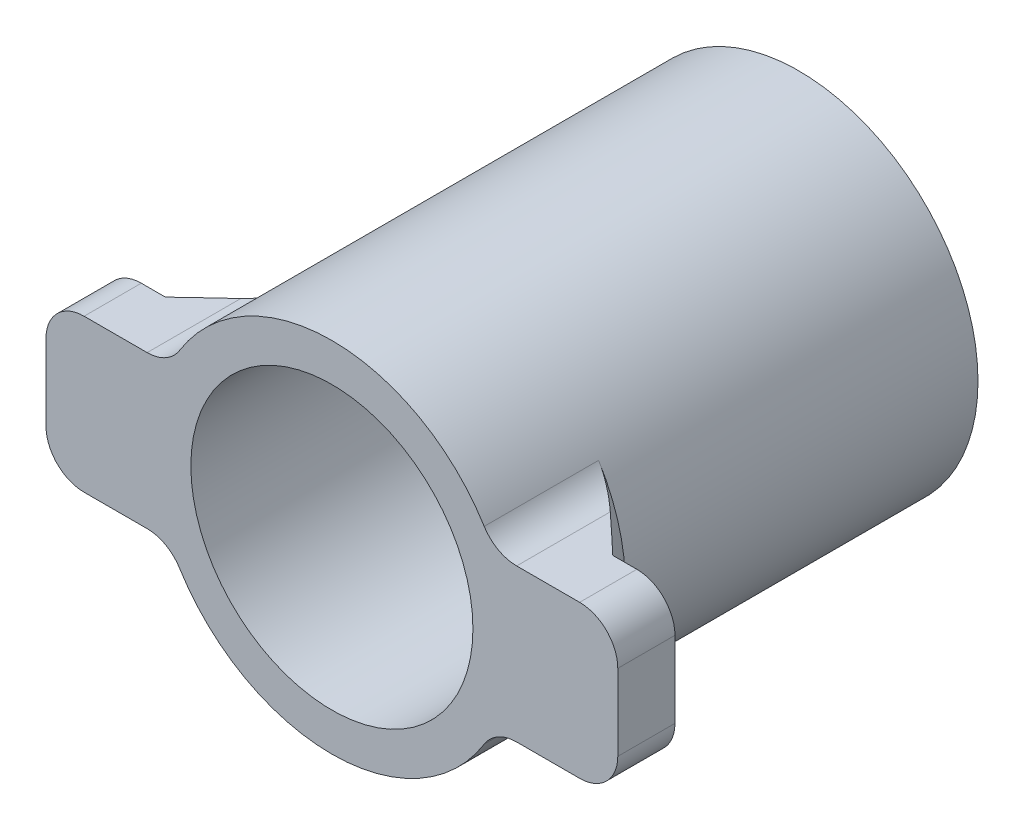
ISO-10303-21;
HEADER;
FILE_DESCRIPTION(('STEP AP214'),'2;1');
FILE_NAME('part.step','',(''),(''),'','','');
FILE_SCHEMA(('AUTOMOTIVE_DESIGN { 1 0 10303 214 1 1 1 1 }'));
ENDSEC;
DATA;
#1=APPLICATION_CONTEXT('core data for automotive mechanical design processes');
#2=APPLICATION_PROTOCOL_DEFINITION('international standard','automotive_design',2000,#1);
#3=PRODUCT_CONTEXT('',#1,'mechanical');
#4=PRODUCT('Part','Part','',(#3));
#5=PRODUCT_RELATED_PRODUCT_CATEGORY('part','',(#4));
#6=PRODUCT_DEFINITION_FORMATION('','',#4);
#7=PRODUCT_DEFINITION_CONTEXT('part definition',#1,'design');
#8=PRODUCT_DEFINITION('design','',#6,#7);
#9=PRODUCT_DEFINITION_SHAPE('','',#8);
#10=(LENGTH_UNIT() NAMED_UNIT(*) SI_UNIT(.MILLI.,.METRE.));
#11=(NAMED_UNIT(*) PLANE_ANGLE_UNIT() SI_UNIT($,.RADIAN.));
#12=(NAMED_UNIT(*) SI_UNIT($,.STERADIAN.) SOLID_ANGLE_UNIT());
#13=UNCERTAINTY_MEASURE_WITH_UNIT(LENGTH_MEASURE(1.E-05),#10,'distance_accuracy_value','');
#14=(GEOMETRIC_REPRESENTATION_CONTEXT(3) GLOBAL_UNCERTAINTY_ASSIGNED_CONTEXT((#13)) GLOBAL_UNIT_ASSIGNED_CONTEXT((#10,
#11,#12)) REPRESENTATION_CONTEXT('',''));
#15=CARTESIAN_POINT('',(0.,0.,0.));
#16=DIRECTION('',(0.,0.,1.));
#17=DIRECTION('',(1.,0.,0.));
#18=AXIS2_PLACEMENT_3D('',#15,#16,#17);
#19=CARTESIAN_POINT('',(0.,0.,24.5));
#20=DIRECTION('',(0.,0.,1.));
#21=DIRECTION('',(1.,0.,0.));
#22=AXIS2_PLACEMENT_3D('',#19,#20,#21);
#23=PLANE('',#22);
#24=DIRECTION('',(0.,1.,0.));
#25=VECTOR('',#24,1.);
#26=CARTESIAN_POINT('',(15.,-4.,24.5));
#27=LINE('',#26,#25);
#28=CARTESIAN_POINT('',(15.,-2.,24.5));
#29=VERTEX_POINT('',#28);
#30=CARTESIAN_POINT('',(15.,2.,24.5));
#31=VERTEX_POINT('',#30);
#32=EDGE_CURVE('E171',#29,#31,#27,.T.);
#33=ORIENTED_EDGE('',*,*,#32,.T.);
#34=CARTESIAN_POINT('',(13.,2.,24.5));
#35=DIRECTION('',(0.,0.,1.));
#36=DIRECTION('',(1.,0.,0.));
#37=AXIS2_PLACEMENT_3D('',#34,#35,#36);
#38=CIRCLE('',#37,2.);
#39=CARTESIAN_POINT('',(13.,4.,24.5));
#40=VERTEX_POINT('',#39);
#41=EDGE_CURVE('E206',#31,#40,#38,.T.);
#42=ORIENTED_EDGE('',*,*,#41,.T.);
#43=DIRECTION('',(-1.,0.,0.));
#44=VECTOR('',#43,1.);
#45=CARTESIAN_POINT('',(6.22575296650935,4.,24.5));
#46=LINE('',#45,#44);
#47=CARTESIAN_POINT('',(9.69329665284211,4.,24.5));
#48=VERTEX_POINT('',#47);
#49=EDGE_CURVE('E187',#40,#48,#46,.T.);
#50=ORIENTED_EDGE('',*,*,#49,.T.);
#51=CARTESIAN_POINT('',(9.69329665284211,6.,24.5));
#52=DIRECTION('',(0.,0.,1.));
#53=DIRECTION('',(1.,0.,0.));
#54=AXIS2_PLACEMENT_3D('',#51,#52,#53);
#55=CIRCLE('',#54,2.);
#56=CARTESIAN_POINT('',(7.99271829269437,4.94736842105263,24.5));
#57=VERTEX_POINT('',#56);
#58=EDGE_CURVE('E252',#48,#57,#55,.F.);
#59=ORIENTED_EDGE('',*,*,#58,.T.);
#60=CARTESIAN_POINT('',(0.,0.,24.5));
#61=DIRECTION('',(0.,0.,1.));
#62=DIRECTION('',(1.,0.,0.));
#63=AXIS2_PLACEMENT_3D('',#60,#61,#62);
#64=CIRCLE('',#63,9.4);
#65=CARTESIAN_POINT('',(-7.99271829269437,4.94736842105263,24.5));
#66=VERTEX_POINT('',#65);
#67=EDGE_CURVE('E194',#57,#66,#64,.T.);
#68=ORIENTED_EDGE('',*,*,#67,.T.);
#69=CARTESIAN_POINT('',(-9.69329665284211,6.,24.5));
#70=DIRECTION('',(0.,0.,1.));
#71=DIRECTION('',(1.,0.,0.));
#72=AXIS2_PLACEMENT_3D('',#69,#70,#71);
#73=CIRCLE('',#72,2.);
#74=CARTESIAN_POINT('',(-9.69329665284211,4.,24.5));
#75=VERTEX_POINT('',#74);
#76=EDGE_CURVE('E246',#66,#75,#73,.F.);
#77=ORIENTED_EDGE('',*,*,#76,.T.);
#78=DIRECTION('',(-1.,0.,0.));
#79=VECTOR('',#78,1.);
#80=CARTESIAN_POINT('',(-15.,4.,24.5));
#81=LINE('',#80,#79);
#82=CARTESIAN_POINT('',(-13.,4.,24.5));
#83=VERTEX_POINT('',#82);
#84=EDGE_CURVE('E394',#75,#83,#81,.T.);
#85=ORIENTED_EDGE('',*,*,#84,.T.);
#86=CARTESIAN_POINT('',(-13.,2.,24.5));
#87=DIRECTION('',(0.,0.,1.));
#88=DIRECTION('',(1.,0.,0.));
#89=AXIS2_PLACEMENT_3D('',#86,#87,#88);
#90=CIRCLE('',#89,2.);
#91=CARTESIAN_POINT('',(-15.,2.,24.5));
#92=VERTEX_POINT('',#91);
#93=EDGE_CURVE('E204',#83,#92,#90,.T.);
#94=ORIENTED_EDGE('',*,*,#93,.T.);
#95=DIRECTION('',(0.,-1.,0.));
#96=VECTOR('',#95,1.);
#97=CARTESIAN_POINT('',(-15.,-4.,24.5));
#98=LINE('',#97,#96);
#99=CARTESIAN_POINT('',(-15.,-2.,24.5));
#100=VERTEX_POINT('',#99);
#101=EDGE_CURVE('E401',#92,#100,#98,.T.);
#102=ORIENTED_EDGE('',*,*,#101,.T.);
#103=CARTESIAN_POINT('',(-13.,-2.,24.5));
#104=DIRECTION('',(0.,0.,1.));
#105=DIRECTION('',(1.,0.,0.));
#106=AXIS2_PLACEMENT_3D('',#103,#104,#105);
#107=CIRCLE('',#106,2.);
#108=CARTESIAN_POINT('',(-13.,-4.,24.5));
#109=VERTEX_POINT('',#108);
#110=EDGE_CURVE('E177',#100,#109,#107,.T.);
#111=ORIENTED_EDGE('',*,*,#110,.T.);
#112=DIRECTION('',(1.,0.,0.));
#113=VECTOR('',#112,1.);
#114=CARTESIAN_POINT('',(-15.,-4.,24.5));
#115=LINE('',#114,#113);
#116=CARTESIAN_POINT('',(-9.69329665284211,-4.,24.5));
#117=VERTEX_POINT('',#116);
#118=EDGE_CURVE('E398',#109,#117,#115,.T.);
#119=ORIENTED_EDGE('',*,*,#118,.T.);
#120=CARTESIAN_POINT('',(-9.69329665284211,-6.,24.5));
#121=DIRECTION('',(0.,0.,1.));
#122=DIRECTION('',(1.,0.,0.));
#123=AXIS2_PLACEMENT_3D('',#120,#121,#122);
#124=CIRCLE('',#123,2.);
#125=CARTESIAN_POINT('',(-7.99271829269437,-4.94736842105263,24.5));
#126=VERTEX_POINT('',#125);
#127=EDGE_CURVE('E248',#117,#126,#124,.F.);
#128=ORIENTED_EDGE('',*,*,#127,.T.);
#129=CARTESIAN_POINT('',(7.99271829269437,-4.94736842105263,24.5));
#130=VERTEX_POINT('',#129);
#131=EDGE_CURVE('E198',#126,#130,#64,.T.);
#132=ORIENTED_EDGE('',*,*,#131,.T.);
#133=CARTESIAN_POINT('',(9.69329665284211,-6.,24.5));
#134=DIRECTION('',(0.,0.,1.));
#135=DIRECTION('',(1.,0.,0.));
#136=AXIS2_PLACEMENT_3D('',#133,#134,#135);
#137=CIRCLE('',#136,2.);
#138=CARTESIAN_POINT('',(9.69329665284211,-4.,24.5));
#139=VERTEX_POINT('',#138);
#140=EDGE_CURVE('E250',#130,#139,#137,.F.);
#141=ORIENTED_EDGE('',*,*,#140,.T.);
#142=DIRECTION('',(1.,0.,0.));
#143=VECTOR('',#142,1.);
#144=CARTESIAN_POINT('',(6.22575296650935,-4.,24.5));
#145=LINE('',#144,#143);
#146=CARTESIAN_POINT('',(13.,-4.,24.5));
#147=VERTEX_POINT('',#146);
#148=EDGE_CURVE('E172',#139,#147,#145,.T.);
#149=ORIENTED_EDGE('',*,*,#148,.T.);
#150=CARTESIAN_POINT('',(13.,-2.,24.5));
#151=DIRECTION('',(0.,0.,1.));
#152=DIRECTION('',(1.,0.,0.));
#153=AXIS2_PLACEMENT_3D('',#150,#151,#152);
#154=CIRCLE('',#153,2.);
#155=EDGE_CURVE('E168',#147,#29,#154,.T.);
#156=ORIENTED_EDGE('',*,*,#155,.T.);
#157=EDGE_LOOP('',(#33,#42,#50,#59,#68,#77,#85,#94,#102,#111,#119,#128,#132,#141,#149,#156));
#158=FACE_BOUND('',#157,.T.);
#159=CARTESIAN_POINT('',(0.,0.,24.5));
#160=DIRECTION('',(0.,0.,1.));
#161=DIRECTION('',(1.,0.,0.));
#162=AXIS2_PLACEMENT_3D('',#159,#160,#161);
#163=CIRCLE('',#162,7.4);
#164=CARTESIAN_POINT('',(7.4,0.,24.5));
#165=VERTEX_POINT('',#164);
#166=EDGE_CURVE('E377',#165,#165,#163,.T.);
#167=ORIENTED_EDGE('',*,*,#166,.F.);
#168=EDGE_LOOP('',(#167));
#169=FACE_BOUND('',#168,.T.);
#170=ADVANCED_FACE('F35',(#158,#169),#23,.T.);
#171=CARTESIAN_POINT('',(0.,0.,0.));
#172=DIRECTION('',(0.,0.,1.));
#173=DIRECTION('',(1.,0.,0.));
#174=AXIS2_PLACEMENT_3D('',#171,#172,#173);
#175=PLANE('',#174);
#176=CARTESIAN_POINT('',(0.,0.,0.));
#177=DIRECTION('',(0.,0.,1.));
#178=DIRECTION('',(1.,0.,0.));
#179=AXIS2_PLACEMENT_3D('',#176,#177,#178);
#180=CIRCLE('',#179,9.4);
#181=CARTESIAN_POINT('',(9.4,0.,0.));
#182=VERTEX_POINT('',#181);
#183=EDGE_CURVE('E201',#182,#182,#180,.T.);
#184=ORIENTED_EDGE('',*,*,#183,.F.);
#185=EDGE_LOOP('',(#184));
#186=FACE_BOUND('',#185,.T.);
#187=CARTESIAN_POINT('',(0.,0.,0.));
#188=DIRECTION('',(0.,0.,1.));
#189=DIRECTION('',(1.,0.,0.));
#190=AXIS2_PLACEMENT_3D('',#187,#188,#189);
#191=CIRCLE('',#190,7.4);
#192=CARTESIAN_POINT('',(7.4,0.,0.));
#193=VERTEX_POINT('',#192);
#194=EDGE_CURVE('E379',#193,#193,#191,.T.);
#195=ORIENTED_EDGE('',*,*,#194,.T.);
#196=EDGE_LOOP('',(#195));
#197=FACE_BOUND('',#196,.T.);
#198=ADVANCED_FACE('F449',(#186,#197),#175,.F.);
#199=CARTESIAN_POINT('',(0.,0.,24.5));
#200=DIRECTION('',(0.,0.,-1.));
#201=DIRECTION('',(-1.,0.,0.));
#202=AXIS2_PLACEMENT_3D('',#199,#200,#201);
#203=CYLINDRICAL_SURFACE('',#202,9.4);
#204=DIRECTION('',(0.,0.,-1.));
#205=VECTOR('',#204,1.);
#206=CARTESIAN_POINT('',(-7.99271829269437,-4.94736842105263,24.5));
#207=LINE('',#206,#205);
#208=CARTESIAN_POINT('',(-7.99271829269437,-4.94736842105263,18.5));
#209=VERTEX_POINT('',#208);
#210=EDGE_CURVE('E241',#126,#209,#207,.T.);
#211=ORIENTED_EDGE('',*,*,#210,.T.);
#212=CARTESIAN_POINT('',(0.,0.,18.5));
#213=DIRECTION('',(0.,0.,1.));
#214=DIRECTION('',(1.,0.,0.));
#215=AXIS2_PLACEMENT_3D('',#212,#213,#214);
#216=CIRCLE('',#215,9.4);
#217=CARTESIAN_POINT('',(-7.99271829269437,4.94736842105263,18.5));
#218=VERTEX_POINT('',#217);
#219=EDGE_CURVE('E260',#209,#218,#216,.F.);
#220=ORIENTED_EDGE('',*,*,#219,.T.);
#221=DIRECTION('',(0.,0.,-1.));
#222=VECTOR('',#221,1.);
#223=CARTESIAN_POINT('',(-7.99271829269437,4.94736842105263,24.5));
#224=LINE('',#223,#222);
#225=EDGE_CURVE('E243',#218,#66,#224,.F.);
#226=ORIENTED_EDGE('',*,*,#225,.T.);
#227=ORIENTED_EDGE('',*,*,#67,.F.);
#228=DIRECTION('',(0.,0.,-1.));
#229=VECTOR('',#228,1.);
#230=CARTESIAN_POINT('',(7.99271829269437,4.94736842105263,24.5));
#231=LINE('',#230,#229);
#232=CARTESIAN_POINT('',(7.99271829269437,4.94736842105263,18.5));
#233=VERTEX_POINT('',#232);
#234=EDGE_CURVE('E236',#57,#233,#231,.T.);
#235=ORIENTED_EDGE('',*,*,#234,.T.);
#236=CARTESIAN_POINT('',(0.,0.,18.5));
#237=DIRECTION('',(0.,0.,1.));
#238=DIRECTION('',(1.,0.,0.));
#239=AXIS2_PLACEMENT_3D('',#236,#237,#238);
#240=CIRCLE('',#239,9.4);
#241=CARTESIAN_POINT('',(7.99271829269437,-4.94736842105263,18.5));
#242=VERTEX_POINT('',#241);
#243=EDGE_CURVE('E257',#233,#242,#240,.F.);
#244=ORIENTED_EDGE('',*,*,#243,.T.);
#245=DIRECTION('',(0.,0.,-1.));
#246=VECTOR('',#245,1.);
#247=CARTESIAN_POINT('',(7.99271829269437,-4.94736842105263,24.5));
#248=LINE('',#247,#246);
#249=EDGE_CURVE('E238',#242,#130,#248,.F.);
#250=ORIENTED_EDGE('',*,*,#249,.T.);
#251=ORIENTED_EDGE('',*,*,#131,.F.);
#252=EDGE_LOOP('',(#211,#220,#226,#227,#235,#244,#250,#251));
#253=FACE_BOUND('',#252,.T.);
#254=ORIENTED_EDGE('',*,*,#183,.T.);
#255=EDGE_LOOP('',(#254));
#256=FACE_BOUND('',#255,.T.);
#257=ADVANCED_FACE('F371',(#253,#256),#203,.T.);
#258=CARTESIAN_POINT('',(0.,0.,24.5));
#259=DIRECTION('',(0.,0.,-1.));
#260=DIRECTION('',(-1.,0.,0.));
#261=AXIS2_PLACEMENT_3D('',#258,#259,#260);
#262=CYLINDRICAL_SURFACE('',#261,7.4);
#263=ORIENTED_EDGE('',*,*,#166,.T.);
#264=EDGE_LOOP('',(#263));
#265=FACE_BOUND('',#264,.T.);
#266=ORIENTED_EDGE('',*,*,#194,.F.);
#267=EDGE_LOOP('',(#266));
#268=FACE_BOUND('',#267,.T.);
#269=ADVANCED_FACE('F308',(#265,#268),#262,.F.);
#270=CARTESIAN_POINT('',(6.22575296650935,-4.,21.5));
#271=DIRECTION('',(0.,-1.,0.));
#272=DIRECTION('',(0.,0.,-1.));
#273=AXIS2_PLACEMENT_3D('',#270,#271,#272);
#274=PLANE('',#273);
#275=DIRECTION('',(0.,0.,-1.));
#276=VECTOR('',#275,1.);
#277=CARTESIAN_POINT('',(9.69329665284211,-4.,21.5));
#278=LINE('',#277,#276);
#279=CARTESIAN_POINT('',(9.69329665284211,-4.,19.5861813831347));
#280=VERTEX_POINT('',#279);
#281=EDGE_CURVE('E56',#139,#280,#278,.T.);
#282=ORIENTED_EDGE('',*,*,#281,.T.);
#283=CARTESIAN_POINT('',(9.69329665284211,-4.,19.5861813831347));
#284=CARTESIAN_POINT('',(9.86463761199018,-4.,19.744571624579));
#285=CARTESIAN_POINT('',(10.0356785196265,-4.,19.9032858860963));
#286=CARTESIAN_POINT('',(10.377227790418,-4.,20.2212835285584));
#287=CARTESIAN_POINT('',(10.5477361581503,-4.,20.3805669045862));
#288=CARTESIAN_POINT('',(10.8882905166018,-4.,20.6996262676898));
#289=CARTESIAN_POINT('',(11.0583365082495,-4.,20.8594022537748));
#290=CARTESIAN_POINT('',(11.3980211369074,-4.,21.1793896343187));
#291=CARTESIAN_POINT('',(11.5676597703986,-4.,21.3396010325137));
#292=CARTESIAN_POINT('',(11.737120600897,-4.,21.5));
#293=B_SPLINE_CURVE_WITH_KNOTS('',3,(#283,#284,#285,#286,#287,#288,#289,#290,#291,#292),
.UNSPECIFIED.,.F.,.F.,(4,2,2,2,4),(0.,0.700003841992181,1.40000165071963,2.09999805253871,
2.80000047987281),.UNSPECIFIED.);
#294=CARTESIAN_POINT('',(11.737120600897,-4.,21.5));
#295=VERTEX_POINT('',#294);
#296=EDGE_CURVE('E11',#280,#295,#293,.T.);
#297=ORIENTED_EDGE('',*,*,#296,.T.);
#298=DIRECTION('',(1.,0.,0.));
#299=VECTOR('',#298,1.);
#300=CARTESIAN_POINT('',(6.22575296650935,-4.,21.5));
#301=LINE('',#300,#299);
#302=CARTESIAN_POINT('',(13.,-4.,21.5));
#303=VERTEX_POINT('',#302);
#304=EDGE_CURVE('E382',#295,#303,#301,.T.);
#305=ORIENTED_EDGE('',*,*,#304,.T.);
#306=DIRECTION('',(0.,0.,1.));
#307=VECTOR('',#306,1.);
#308=CARTESIAN_POINT('',(13.,-4.,21.5));
#309=LINE('',#308,#307);
#310=EDGE_CURVE('E234',#303,#147,#309,.T.);
#311=ORIENTED_EDGE('',*,*,#310,.T.);
#312=ORIENTED_EDGE('',*,*,#148,.F.);
#313=EDGE_LOOP('',(#282,#297,#305,#311,#312));
#314=FACE_BOUND('',#313,.T.);
#315=ADVANCED_FACE('F304',(#314),#274,.T.);
#316=CARTESIAN_POINT('',(6.22575296650935,4.,21.5));
#317=DIRECTION('',(0.,1.,0.));
#318=DIRECTION('',(0.,0.,1.));
#319=AXIS2_PLACEMENT_3D('',#316,#317,#318);
#320=PLANE('',#319);
#321=ORIENTED_EDGE('',*,*,#49,.F.);
#322=DIRECTION('',(0.,0.,1.));
#323=VECTOR('',#322,1.);
#324=CARTESIAN_POINT('',(13.,4.,21.5));
#325=LINE('',#324,#323);
#326=CARTESIAN_POINT('',(13.,4.,21.5));
#327=VERTEX_POINT('',#326);
#328=EDGE_CURVE('E209',#40,#327,#325,.F.);
#329=ORIENTED_EDGE('',*,*,#328,.T.);
#330=DIRECTION('',(-1.,0.,0.));
#331=VECTOR('',#330,1.);
#332=CARTESIAN_POINT('',(6.22575296650935,4.,21.5));
#333=LINE('',#332,#331);
#334=CARTESIAN_POINT('',(11.737120600897,4.,21.5));
#335=VERTEX_POINT('',#334);
#336=EDGE_CURVE('E390',#327,#335,#333,.T.);
#337=ORIENTED_EDGE('',*,*,#336,.T.);
#338=CARTESIAN_POINT('',(11.737120600897,4.,21.5));
#339=CARTESIAN_POINT('',(11.5676597703986,4.,21.3396010325137));
#340=CARTESIAN_POINT('',(11.3980211369074,4.,21.1793896343187));
#341=CARTESIAN_POINT('',(11.0583365082495,4.,20.8594022537748));
#342=CARTESIAN_POINT('',(10.8882905166018,4.,20.6996262676898));
#343=CARTESIAN_POINT('',(10.5477361581503,4.,20.3805669045862));
#344=CARTESIAN_POINT('',(10.377227790418,4.,20.2212835285584));
#345=CARTESIAN_POINT('',(10.0356785196265,4.,19.9032858860963));
#346=CARTESIAN_POINT('',(9.86463761199018,4.,19.744571624579));
#347=CARTESIAN_POINT('',(9.69329665284211,4.,19.5861813831347));
#348=B_SPLINE_CURVE_WITH_KNOTS('',3,(#338,#339,#340,#341,#342,#343,#344,#345,#346,#347),
.UNSPECIFIED.,.F.,.F.,(4,2,2,2,4),(0.,0.700002427334092,1.39999882915318,2.09999663788062,
2.80000047987281),.UNSPECIFIED.);
#349=CARTESIAN_POINT('',(9.69329665284211,4.,19.5861813831347));
#350=VERTEX_POINT('',#349);
#351=EDGE_CURVE('E315',#335,#350,#348,.T.);
#352=ORIENTED_EDGE('',*,*,#351,.T.);
#353=DIRECTION('',(0.,0.,-1.));
#354=VECTOR('',#353,1.);
#355=CARTESIAN_POINT('',(9.69329665284211,4.,21.5));
#356=LINE('',#355,#354);
#357=EDGE_CURVE('E64',#350,#48,#356,.F.);
#358=ORIENTED_EDGE('',*,*,#357,.T.);
#359=EDGE_LOOP('',(#321,#329,#337,#352,#358));
#360=FACE_BOUND('',#359,.T.);
#361=ADVANCED_FACE('F302',(#360),#320,.T.);
#362=CARTESIAN_POINT('',(0.,0.,21.5));
#363=DIRECTION('',(0.,0.,1.));
#364=DIRECTION('',(1.,0.,0.));
#365=AXIS2_PLACEMENT_3D('',#362,#363,#364);
#366=PLANE('',#365);
#367=ORIENTED_EDGE('',*,*,#304,.F.);
#368=CARTESIAN_POINT('',(0.,0.,21.5));
#369=DIRECTION('',(0.,0.,1.));
#370=DIRECTION('',(1.,0.,0.));
#371=AXIS2_PLACEMENT_3D('',#368,#369,#370);
#372=CIRCLE('',#371,12.4);
#373=EDGE_CURVE('E263',#295,#335,#372,.T.);
#374=ORIENTED_EDGE('',*,*,#373,.T.);
#375=ORIENTED_EDGE('',*,*,#336,.F.);
#376=CARTESIAN_POINT('',(13.,2.,21.5));
#377=DIRECTION('',(0.,0.,1.));
#378=DIRECTION('',(1.,0.,0.));
#379=AXIS2_PLACEMENT_3D('',#376,#377,#378);
#380=CIRCLE('',#379,2.);
#381=CARTESIAN_POINT('',(15.,2.,21.5));
#382=VERTEX_POINT('',#381);
#383=EDGE_CURVE('E212',#327,#382,#380,.F.);
#384=ORIENTED_EDGE('',*,*,#383,.T.);
#385=DIRECTION('',(0.,1.,0.));
#386=VECTOR('',#385,1.);
#387=CARTESIAN_POINT('',(15.,-4.,21.5));
#388=LINE('',#387,#386);
#389=CARTESIAN_POINT('',(15.,-2.,21.5));
#390=VERTEX_POINT('',#389);
#391=EDGE_CURVE('E386',#390,#382,#388,.T.);
#392=ORIENTED_EDGE('',*,*,#391,.F.);
#393=CARTESIAN_POINT('',(13.,-2.,21.5));
#394=DIRECTION('',(0.,0.,1.));
#395=DIRECTION('',(1.,0.,0.));
#396=AXIS2_PLACEMENT_3D('',#393,#394,#395);
#397=CIRCLE('',#396,2.);
#398=EDGE_CURVE('E193',#390,#303,#397,.F.);
#399=ORIENTED_EDGE('',*,*,#398,.T.);
#400=EDGE_LOOP('',(#367,#374,#375,#384,#392,#399));
#401=FACE_BOUND('',#400,.T.);
#402=ADVANCED_FACE('F300',(#401),#366,.F.);
#403=CARTESIAN_POINT('',(15.,-4.,21.5));
#404=DIRECTION('',(1.,0.,0.));
#405=DIRECTION('',(0.,0.,-1.));
#406=AXIS2_PLACEMENT_3D('',#403,#404,#405);
#407=PLANE('',#406);
#408=ORIENTED_EDGE('',*,*,#391,.T.);
#409=DIRECTION('',(0.,0.,1.));
#410=VECTOR('',#409,1.);
#411=CARTESIAN_POINT('',(15.,2.,21.5));
#412=LINE('',#411,#410);
#413=EDGE_CURVE('E178',#382,#31,#412,.T.);
#414=ORIENTED_EDGE('',*,*,#413,.T.);
#415=ORIENTED_EDGE('',*,*,#32,.F.);
#416=DIRECTION('',(0.,0.,1.));
#417=VECTOR('',#416,1.);
#418=CARTESIAN_POINT('',(15.,-2.,21.5));
#419=LINE('',#418,#417);
#420=EDGE_CURVE('E184',#29,#390,#419,.F.);
#421=ORIENTED_EDGE('',*,*,#420,.T.);
#422=EDGE_LOOP('',(#408,#414,#415,#421));
#423=FACE_BOUND('',#422,.T.);
#424=ADVANCED_FACE('F183',(#423),#407,.T.);
#425=CARTESIAN_POINT('',(-15.,4.,21.5));
#426=DIRECTION('',(0.,1.,0.));
#427=DIRECTION('',(0.,0.,1.));
#428=AXIS2_PLACEMENT_3D('',#425,#426,#427);
#429=PLANE('',#428);
#430=DIRECTION('',(0.,0.,-1.));
#431=VECTOR('',#430,1.);
#432=CARTESIAN_POINT('',(-9.69329665284211,4.,21.5));
#433=LINE('',#432,#431);
#434=CARTESIAN_POINT('',(-9.69329665284211,4.,19.5861813831347));
#435=VERTEX_POINT('',#434);
#436=EDGE_CURVE('E214',#75,#435,#433,.T.);
#437=ORIENTED_EDGE('',*,*,#436,.T.);
#438=CARTESIAN_POINT('',(-9.69329665284211,4.,19.5861813831347));
#439=CARTESIAN_POINT('',(-9.86463761199018,4.,19.744571624579));
#440=CARTESIAN_POINT('',(-10.0356785196265,4.,19.9032858860963));
#441=CARTESIAN_POINT('',(-10.377227790418,4.,20.2212835285584));
#442=CARTESIAN_POINT('',(-10.5477361581503,4.,20.3805669045862));
#443=CARTESIAN_POINT('',(-10.8882905166018,4.,20.6996262676898));
#444=CARTESIAN_POINT('',(-11.0583365082495,4.,20.8594022537748));
#445=CARTESIAN_POINT('',(-11.3980211369074,4.,21.1793896343187));
#446=CARTESIAN_POINT('',(-11.5676597703986,4.,21.3396010325137));
#447=CARTESIAN_POINT('',(-11.737120600897,4.,21.5));
#448=B_SPLINE_CURVE_WITH_KNOTS('',3,(#438,#439,#440,#441,#442,#443,#444,#445,#446,#447),
.UNSPECIFIED.,.F.,.F.,(4,2,2,2,4),(0.,0.700003841992182,1.40000165071963,2.09999805253871,
2.80000047987281),.UNSPECIFIED.);
#449=CARTESIAN_POINT('',(-11.737120600897,4.,21.5));
#450=VERTEX_POINT('',#449);
#451=EDGE_CURVE('E323',#435,#450,#448,.T.);
#452=ORIENTED_EDGE('',*,*,#451,.T.);
#453=DIRECTION('',(-1.,0.,0.));
#454=VECTOR('',#453,1.);
#455=CARTESIAN_POINT('',(-15.,4.,21.5));
#456=LINE('',#455,#454);
#457=CARTESIAN_POINT('',(-13.,4.,21.5));
#458=VERTEX_POINT('',#457);
#459=EDGE_CURVE('E188',#450,#458,#456,.T.);
#460=ORIENTED_EDGE('',*,*,#459,.T.);
#461=DIRECTION('',(0.,0.,1.));
#462=VECTOR('',#461,1.);
#463=CARTESIAN_POINT('',(-13.,4.,21.5));
#464=LINE('',#463,#462);
#465=EDGE_CURVE('E216',#458,#83,#464,.T.);
#466=ORIENTED_EDGE('',*,*,#465,.T.);
#467=ORIENTED_EDGE('',*,*,#84,.F.);
#468=EDGE_LOOP('',(#437,#452,#460,#466,#467));
#469=FACE_BOUND('',#468,.T.);
#470=ADVANCED_FACE('F291',(#469),#429,.T.);
#471=CARTESIAN_POINT('',(-15.,-4.,21.5));
#472=DIRECTION('',(0.,-1.,0.));
#473=DIRECTION('',(0.,0.,-1.));
#474=AXIS2_PLACEMENT_3D('',#471,#472,#473);
#475=PLANE('',#474);
#476=ORIENTED_EDGE('',*,*,#118,.F.);
#477=DIRECTION('',(0.,0.,1.));
#478=VECTOR('',#477,1.);
#479=CARTESIAN_POINT('',(-13.,-4.,21.5));
#480=LINE('',#479,#478);
#481=CARTESIAN_POINT('',(-13.,-4.,21.5));
#482=VERTEX_POINT('',#481);
#483=EDGE_CURVE('E231',#109,#482,#480,.F.);
#484=ORIENTED_EDGE('',*,*,#483,.T.);
#485=DIRECTION('',(1.,0.,0.));
#486=VECTOR('',#485,1.);
#487=CARTESIAN_POINT('',(-15.,-4.,21.5));
#488=LINE('',#487,#486);
#489=CARTESIAN_POINT('',(-11.737120600897,-4.,21.5));
#490=VERTEX_POINT('',#489);
#491=EDGE_CURVE('E405',#482,#490,#488,.T.);
#492=ORIENTED_EDGE('',*,*,#491,.T.);
#493=CARTESIAN_POINT('',(-11.737120600897,-4.,21.5));
#494=CARTESIAN_POINT('',(-11.5676597703986,-4.,21.3396010325137));
#495=CARTESIAN_POINT('',(-11.3980211369074,-4.,21.1793896343187));
#496=CARTESIAN_POINT('',(-11.0583365082495,-4.,20.8594022537748));
#497=CARTESIAN_POINT('',(-10.8882905166018,-4.,20.6996262676898));
#498=CARTESIAN_POINT('',(-10.5477361581503,-4.,20.3805669045862));
#499=CARTESIAN_POINT('',(-10.377227790418,-4.,20.2212835285584));
#500=CARTESIAN_POINT('',(-10.0356785196265,-4.,19.9032858860963));
#501=CARTESIAN_POINT('',(-9.86463761199018,-4.,19.744571624579));
#502=CARTESIAN_POINT('',(-9.69329665284211,-4.,19.5861813831347));
#503=B_SPLINE_CURVE_WITH_KNOTS('',3,(#493,#494,#495,#496,#497,#498,#499,#500,#501,#502),
.UNSPECIFIED.,.F.,.F.,(4,2,2,2,4),(0.,0.700002427334091,1.39999882915318,2.09999663788062,
2.8000004798728),.UNSPECIFIED.);
#504=CARTESIAN_POINT('',(-9.69329665284211,-4.,19.5861813831347));
#505=VERTEX_POINT('',#504);
#506=EDGE_CURVE('E266',#490,#505,#503,.T.);
#507=ORIENTED_EDGE('',*,*,#506,.T.);
#508=DIRECTION('',(0.,0.,-1.));
#509=VECTOR('',#508,1.);
#510=CARTESIAN_POINT('',(-9.69329665284211,-4.,21.5));
#511=LINE('',#510,#509);
#512=EDGE_CURVE('E229',#505,#117,#511,.F.);
#513=ORIENTED_EDGE('',*,*,#512,.T.);
#514=EDGE_LOOP('',(#476,#484,#492,#507,#513));
#515=FACE_BOUND('',#514,.T.);
#516=ADVANCED_FACE('F285',(#515),#475,.T.);
#517=CARTESIAN_POINT('',(0.,0.,21.5));
#518=DIRECTION('',(0.,0.,1.));
#519=DIRECTION('',(1.,0.,0.));
#520=AXIS2_PLACEMENT_3D('',#517,#518,#519);
#521=PLANE('',#520);
#522=ORIENTED_EDGE('',*,*,#459,.F.);
#523=CARTESIAN_POINT('',(0.,0.,21.5));
#524=DIRECTION('',(0.,0.,1.));
#525=DIRECTION('',(1.,0.,0.));
#526=AXIS2_PLACEMENT_3D('',#523,#524,#525);
#527=CIRCLE('',#526,12.4);
#528=EDGE_CURVE('E254',#450,#490,#527,.T.);
#529=ORIENTED_EDGE('',*,*,#528,.T.);
#530=ORIENTED_EDGE('',*,*,#491,.F.);
#531=CARTESIAN_POINT('',(-13.,-2.,21.5));
#532=DIRECTION('',(0.,0.,1.));
#533=DIRECTION('',(1.,0.,0.));
#534=AXIS2_PLACEMENT_3D('',#531,#532,#533);
#535=CIRCLE('',#534,2.);
#536=CARTESIAN_POINT('',(-15.,-2.,21.5));
#537=VERTEX_POINT('',#536);
#538=EDGE_CURVE('E224',#482,#537,#535,.F.);
#539=ORIENTED_EDGE('',*,*,#538,.T.);
#540=DIRECTION('',(0.,-1.,0.));
#541=VECTOR('',#540,1.);
#542=CARTESIAN_POINT('',(-15.,-4.,21.5));
#543=LINE('',#542,#541);
#544=CARTESIAN_POINT('',(-15.,2.,21.5));
#545=VERTEX_POINT('',#544);
#546=EDGE_CURVE('E397',#545,#537,#543,.T.);
#547=ORIENTED_EDGE('',*,*,#546,.F.);
#548=CARTESIAN_POINT('',(-13.,2.,21.5));
#549=DIRECTION('',(0.,0.,1.));
#550=DIRECTION('',(1.,0.,0.));
#551=AXIS2_PLACEMENT_3D('',#548,#549,#550);
#552=CIRCLE('',#551,2.);
#553=EDGE_CURVE('E226',#545,#458,#552,.F.);
#554=ORIENTED_EDGE('',*,*,#553,.T.);
#555=EDGE_LOOP('',(#522,#529,#530,#539,#547,#554));
#556=FACE_BOUND('',#555,.T.);
#557=ADVANCED_FACE('F290',(#556),#521,.F.);
#558=CARTESIAN_POINT('',(-15.,-4.,21.5));
#559=DIRECTION('',(-1.,0.,0.));
#560=DIRECTION('',(0.,0.,1.));
#561=AXIS2_PLACEMENT_3D('',#558,#559,#560);
#562=PLANE('',#561);
#563=ORIENTED_EDGE('',*,*,#101,.F.);
#564=DIRECTION('',(0.,0.,1.));
#565=VECTOR('',#564,1.);
#566=CARTESIAN_POINT('',(-15.,2.,21.5));
#567=LINE('',#566,#565);
#568=EDGE_CURVE('E222',#92,#545,#567,.F.);
#569=ORIENTED_EDGE('',*,*,#568,.T.);
#570=ORIENTED_EDGE('',*,*,#546,.T.);
#571=DIRECTION('',(0.,0.,1.));
#572=VECTOR('',#571,1.);
#573=CARTESIAN_POINT('',(-15.,-2.,21.5));
#574=LINE('',#573,#572);
#575=EDGE_CURVE('E219',#537,#100,#574,.T.);
#576=ORIENTED_EDGE('',*,*,#575,.T.);
#577=EDGE_LOOP('',(#563,#569,#570,#576));
#578=FACE_BOUND('',#577,.T.);
#579=ADVANCED_FACE('F295',(#578),#562,.T.);
#580=CARTESIAN_POINT('',(13.,2.,21.5));
#581=DIRECTION('',(0.,0.,1.));
#582=DIRECTION('',(1.,0.,0.));
#583=AXIS2_PLACEMENT_3D('',#580,#581,#582);
#584=CYLINDRICAL_SURFACE('',#583,2.);
#585=ORIENTED_EDGE('',*,*,#383,.F.);
#586=ORIENTED_EDGE('',*,*,#328,.F.);
#587=ORIENTED_EDGE('',*,*,#41,.F.);
#588=ORIENTED_EDGE('',*,*,#413,.F.);
#589=EDGE_LOOP('',(#585,#586,#587,#588));
#590=FACE_BOUND('',#589,.T.);
#591=ADVANCED_FACE('F298',(#590),#584,.T.);
#592=CARTESIAN_POINT('',(-13.,2.,21.5));
#593=DIRECTION('',(0.,0.,1.));
#594=DIRECTION('',(1.,0.,0.));
#595=AXIS2_PLACEMENT_3D('',#592,#593,#594);
#596=CYLINDRICAL_SURFACE('',#595,2.);
#597=ORIENTED_EDGE('',*,*,#553,.F.);
#598=ORIENTED_EDGE('',*,*,#568,.F.);
#599=ORIENTED_EDGE('',*,*,#93,.F.);
#600=ORIENTED_EDGE('',*,*,#465,.F.);
#601=EDGE_LOOP('',(#597,#598,#599,#600));
#602=FACE_BOUND('',#601,.T.);
#603=ADVANCED_FACE('F440',(#602),#596,.T.);
#604=CARTESIAN_POINT('',(-13.,-2.,21.5));
#605=DIRECTION('',(0.,0.,1.));
#606=DIRECTION('',(1.,0.,0.));
#607=AXIS2_PLACEMENT_3D('',#604,#605,#606);
#608=CYLINDRICAL_SURFACE('',#607,2.);
#609=ORIENTED_EDGE('',*,*,#538,.F.);
#610=ORIENTED_EDGE('',*,*,#483,.F.);
#611=ORIENTED_EDGE('',*,*,#110,.F.);
#612=ORIENTED_EDGE('',*,*,#575,.F.);
#613=EDGE_LOOP('',(#609,#610,#611,#612));
#614=FACE_BOUND('',#613,.T.);
#615=ADVANCED_FACE('F417',(#614),#608,.T.);
#616=CARTESIAN_POINT('',(13.,-2.,21.5));
#617=DIRECTION('',(0.,0.,1.));
#618=DIRECTION('',(1.,0.,0.));
#619=AXIS2_PLACEMENT_3D('',#616,#617,#618);
#620=CYLINDRICAL_SURFACE('',#619,2.);
#621=ORIENTED_EDGE('',*,*,#398,.F.);
#622=ORIENTED_EDGE('',*,*,#420,.F.);
#623=ORIENTED_EDGE('',*,*,#155,.F.);
#624=ORIENTED_EDGE('',*,*,#310,.F.);
#625=EDGE_LOOP('',(#621,#622,#623,#624));
#626=FACE_BOUND('',#625,.T.);
#627=ADVANCED_FACE('F191',(#626),#620,.T.);
#628=CARTESIAN_POINT('',(-9.69329665284211,6.,24.5));
#629=DIRECTION('',(0.,0.,-1.));
#630=DIRECTION('',(-1.,0.,0.));
#631=AXIS2_PLACEMENT_3D('',#628,#629,#630);
#632=CYLINDRICAL_SURFACE('',#631,2.);
#633=ORIENTED_EDGE('',*,*,#225,.F.);
#634=CARTESIAN_POINT('',(-7.99271829269437,4.94736842105263,18.5));
#635=CARTESIAN_POINT('',(-8.01526056894314,4.91092622816181,18.4999828874517));
#636=CARTESIAN_POINT('',(-8.03898833103214,4.87523252410198,18.5016695269512));
#637=CARTESIAN_POINT('',(-8.08849186138051,4.80567675961878,18.5083177632958));
#638=CARTESIAN_POINT('',(-8.11426513324214,4.77181254878817,18.5132754205631));
#639=CARTESIAN_POINT('',(-8.16728722027171,4.70653703150796,18.5262590143076));
#640=CARTESIAN_POINT('',(-8.19451577615101,4.67510209086235,18.5342491915511));
#641=CARTESIAN_POINT('',(-8.25040591316464,4.61444257788965,18.5530769696319));
#642=CARTESIAN_POINT('',(-8.27906783335463,4.58521853268684,18.5639152467783));
#643=CARTESIAN_POINT('',(-8.3664855608874,4.50131361383973,18.6002104099716));
#644=CARTESIAN_POINT('',(-8.42696798330485,4.4500423079033,18.6295235913962));
#645=CARTESIAN_POINT('',(-8.55062288843938,4.35672931315763,18.696318037222));
#646=CARTESIAN_POINT('',(-8.6138032267873,4.31471713225393,18.7338246782694));
#647=CARTESIAN_POINT('',(-8.77542716208606,4.2194349070029,18.836667484889));
#648=CARTESIAN_POINT('',(-8.87471077312805,4.17210637263265,18.9061791143229));
#649=CARTESIAN_POINT('',(-9.07335935571376,4.09551485658736,19.0545592855875));
#650=CARTESIAN_POINT('',(-9.17272371300067,4.06630522440469,19.1334546518428));
#651=CARTESIAN_POINT('',(-9.34296781763254,4.02955738242823,19.2748000382679));
#652=CARTESIAN_POINT('',(-9.41423353389929,4.01828323197011,19.3358753591334));
#653=CARTESIAN_POINT('',(-9.55500352618591,4.00354953153423,19.4597978345394));
#654=CARTESIAN_POINT('',(-9.62451745022175,4.00002670990952,19.5226263715129));
#655=CARTESIAN_POINT('',(-9.69329665284211,4.,19.5861813831347));
#656=B_SPLINE_CURVE_WITH_KNOTS('',3,(#634,#635,#636,#637,#638,#639,#640,#641,#642,#643,#644,
#645,#646,#647,#648,#649,#650,#651,#652,#653,#654,#655),.UNSPECIFIED.,.F.,.F.,(4,2,2,2,2,2,2,2,
2,2,4),(0.,0.128476446255088,0.256798438654252,0.383652052658102,0.51053581655126,
0.762914364148537,1.01608594564341,1.40424895875904,1.79354952465427,2.0768011463179,
2.35773196102417),.UNSPECIFIED.);
#657=EDGE_CURVE('E355',#218,#435,#656,.T.);
#658=ORIENTED_EDGE('',*,*,#657,.T.);
#659=ORIENTED_EDGE('',*,*,#436,.F.);
#660=ORIENTED_EDGE('',*,*,#76,.F.);
#661=EDGE_LOOP('',(#633,#658,#659,#660));
#662=FACE_BOUND('',#661,.T.);
#663=ADVANCED_FACE('F348',(#662),#632,.F.);
#664=CARTESIAN_POINT('',(-9.69329665284211,-6.,24.5));
#665=DIRECTION('',(0.,0.,-1.));
#666=DIRECTION('',(-1.,0.,0.));
#667=AXIS2_PLACEMENT_3D('',#664,#665,#666);
#668=CYLINDRICAL_SURFACE('',#667,2.);
#669=ORIENTED_EDGE('',*,*,#127,.F.);
#670=ORIENTED_EDGE('',*,*,#512,.F.);
#671=CARTESIAN_POINT('',(-9.69329665284211,-4.,19.5861813831347));
#672=CARTESIAN_POINT('',(-9.63159143279887,-4.00001785904682,19.5291579621132));
#673=CARTESIAN_POINT('',(-9.56928869849577,-4.00285752842768,19.472719905291));
#674=CARTESIAN_POINT('',(-9.44353383992267,-4.01464381236615,19.3614204525406));
#675=CARTESIAN_POINT('',(-9.38007884292482,-4.02360860681352,19.3065642582681));
#676=CARTESIAN_POINT('',(-9.25150624355439,-4.04829219147019,19.1983993064114));
#677=CARTESIAN_POINT('',(-9.18637788651162,-4.06410744776165,19.1451247224157));
#678=CARTESIAN_POINT('',(-9.05581629376349,-4.10309322893829,19.0418914477518));
#679=CARTESIAN_POINT('',(-8.99038358287252,-4.12625387966735,18.9919284138653));
#680=CARTESIAN_POINT('',(-8.84989347167174,-4.18470585747853,18.8892167221949));
#681=CARTESIAN_POINT('',(-8.77485301870734,-4.22128959274115,18.8371602178985));
#682=CARTESIAN_POINT('',(-8.62647110306918,-4.30614557551601,18.7412615837956));
#683=CARTESIAN_POINT('',(-8.55312403028575,-4.35437032213352,18.6973873242934));
#684=CARTESIAN_POINT('',(-8.42230069746658,-4.45399922249148,18.6272622216341));
#685=CARTESIAN_POINT('',(-8.36426430057008,-4.50343037986868,18.5992781964525));
#686=CARTESIAN_POINT('',(-8.2524228625339,-4.61080800691834,18.5528624079745));
#687=CARTESIAN_POINT('',(-8.19860966486033,-4.66873740947417,18.5344118268091));
#688=CARTESIAN_POINT('',(-8.11996873058779,-4.76444664267661,18.514453833682));
#689=CARTESIAN_POINT('',(-8.09293845105938,-4.79965587407123,18.5090593799552));
#690=CARTESIAN_POINT('',(-8.04108325623109,-4.87208769053583,18.5018225762429));
#691=CARTESIAN_POINT('',(-8.01626168936214,-4.90931319936203,18.4999855346586));
#692=CARTESIAN_POINT('',(-7.99271829269437,-4.94736842105263,18.5));
#693=B_SPLINE_CURVE_WITH_KNOTS('',3,(#671,#672,#673,#674,#675,#676,#677,#678,#679,#680,#681,
#682,#683,#684,#685,#686,#687,#688,#689,#690,#691,#692),.UNSPECIFIED.,.F.,.F.,(4,2,2,2,2,2,2,2,
2,2,4),(0.,0.252067831526347,0.504887090524649,0.761388503102307,1.0175465609822,
1.31182943348615,1.6049312077393,1.84762752173508,2.08984293460987,2.22376783590054,
2.35789242756008),.UNSPECIFIED.);
#694=EDGE_CURVE('E274',#505,#209,#693,.T.);
#695=ORIENTED_EDGE('',*,*,#694,.T.);
#696=ORIENTED_EDGE('',*,*,#210,.F.);
#697=EDGE_LOOP('',(#669,#670,#695,#696));
#698=FACE_BOUND('',#697,.T.);
#699=ADVANCED_FACE('F343',(#698),#668,.F.);
#700=CARTESIAN_POINT('',(9.69329665284211,-6.,24.5));
#701=DIRECTION('',(0.,0.,-1.));
#702=DIRECTION('',(-1.,0.,0.));
#703=AXIS2_PLACEMENT_3D('',#700,#701,#702);
#704=CYLINDRICAL_SURFACE('',#703,2.);
#705=ORIENTED_EDGE('',*,*,#249,.F.);
#706=CARTESIAN_POINT('',(7.99271829269437,-4.94736842105263,18.5));
#707=CARTESIAN_POINT('',(8.01526056894314,-4.91092622816181,18.4999828874517));
#708=CARTESIAN_POINT('',(8.03898833103214,-4.87523252410198,18.5016695269512));
#709=CARTESIAN_POINT('',(8.08849186138052,-4.80567675961878,18.5083177632958));
#710=CARTESIAN_POINT('',(8.11426513324214,-4.77181254878817,18.5132754205631));
#711=CARTESIAN_POINT('',(8.16728722027171,-4.70653703150796,18.5262590143077));
#712=CARTESIAN_POINT('',(8.19451577615101,-4.67510209086235,18.5342491915511));
#713=CARTESIAN_POINT('',(8.25040591316464,-4.61444257788965,18.5530769696319));
#714=CARTESIAN_POINT('',(8.27906783335464,-4.58521853268684,18.5639152467783));
#715=CARTESIAN_POINT('',(8.36648556088741,-4.50131361383973,18.6002104099716));
#716=CARTESIAN_POINT('',(8.42696798330485,-4.4500423079033,18.6295235913962));
#717=CARTESIAN_POINT('',(8.55062288843938,-4.35672931315763,18.696318037222));
#718=CARTESIAN_POINT('',(8.6138032267873,-4.31471713225393,18.7338246782694));
#719=CARTESIAN_POINT('',(8.77542716208606,-4.2194349070029,18.836667484889));
#720=CARTESIAN_POINT('',(8.87471077312805,-4.17210637263265,18.9061791143229));
#721=CARTESIAN_POINT('',(9.07335935571377,-4.09551485658736,19.0545592855875));
#722=CARTESIAN_POINT('',(9.17272371300068,-4.06630522440469,19.1334546518428));
#723=CARTESIAN_POINT('',(9.34296781763255,-4.02955738242823,19.2748000382679));
#724=CARTESIAN_POINT('',(9.41423353389929,-4.01828323197012,19.3358753591334));
#725=CARTESIAN_POINT('',(9.55500352618592,-4.00354953153423,19.4597978345394));
#726=CARTESIAN_POINT('',(9.62451745022175,-4.00002670990952,19.5226263715129));
#727=CARTESIAN_POINT('',(9.69329665284211,-4.,19.5861813831347));
#728=B_SPLINE_CURVE_WITH_KNOTS('',3,(#706,#707,#708,#709,#710,#711,#712,#713,#714,#715,#716,
#717,#718,#719,#720,#721,#722,#723,#724,#725,#726,#727),.UNSPECIFIED.,.F.,.F.,(4,2,2,2,2,2,2,2,
2,2,4),(0.,0.128476446255089,0.256798438654251,0.383652052658103,0.510535816551261,
0.762914364148537,1.01608594564341,1.40424895875904,1.79354952465427,2.07680114631791,
2.35773196102417),.UNSPECIFIED.);
#729=EDGE_CURVE('E50',#242,#280,#728,.T.);
#730=ORIENTED_EDGE('',*,*,#729,.T.);
#731=ORIENTED_EDGE('',*,*,#281,.F.);
#732=ORIENTED_EDGE('',*,*,#140,.F.);
#733=EDGE_LOOP('',(#705,#730,#731,#732));
#734=FACE_BOUND('',#733,.T.);
#735=ADVANCED_FACE('F340',(#734),#704,.F.);
#736=CARTESIAN_POINT('',(9.69329665284211,6.,24.5));
#737=DIRECTION('',(0.,0.,-1.));
#738=DIRECTION('',(-1.,0.,0.));
#739=AXIS2_PLACEMENT_3D('',#736,#737,#738);
#740=CYLINDRICAL_SURFACE('',#739,2.);
#741=ORIENTED_EDGE('',*,*,#58,.F.);
#742=ORIENTED_EDGE('',*,*,#357,.F.);
#743=CARTESIAN_POINT('',(9.69329665284211,4.,19.5861813831347));
#744=CARTESIAN_POINT('',(9.63159143279887,4.00001785904682,19.5291579621132));
#745=CARTESIAN_POINT('',(9.56928869849577,4.00285752842768,19.472719905291));
#746=CARTESIAN_POINT('',(9.44353383992267,4.01464381236615,19.3614204525406));
#747=CARTESIAN_POINT('',(9.38007884292481,4.02360860681352,19.3065642582681));
#748=CARTESIAN_POINT('',(9.25150624355439,4.04829219147018,19.1983993064114));
#749=CARTESIAN_POINT('',(9.18637788651162,4.06410744776165,19.1451247224157));
#750=CARTESIAN_POINT('',(9.05581629376349,4.10309322893828,19.0418914477518));
#751=CARTESIAN_POINT('',(8.99038358287252,4.12625387966735,18.9919284138653));
#752=CARTESIAN_POINT('',(8.84989347167173,4.18470585747853,18.8892167221949));
#753=CARTESIAN_POINT('',(8.77485301870734,4.22128959274115,18.8371602178985));
#754=CARTESIAN_POINT('',(8.62647110306918,4.306145575516,18.7412615837956));
#755=CARTESIAN_POINT('',(8.55312403028575,4.35437032213351,18.6973873242934));
#756=CARTESIAN_POINT('',(8.42230069746658,4.45399922249148,18.6272622216341));
#757=CARTESIAN_POINT('',(8.36426430057008,4.50343037986868,18.5992781964525));
#758=CARTESIAN_POINT('',(8.2524228625339,4.61080800691834,18.5528624079745));
#759=CARTESIAN_POINT('',(8.19860966486033,4.66873740947417,18.5344118268091));
#760=CARTESIAN_POINT('',(8.11996873058779,4.7644466426766,18.514453833682));
#761=CARTESIAN_POINT('',(8.09293845105938,4.79965587407123,18.5090593799552));
#762=CARTESIAN_POINT('',(8.04108325623109,4.87208769053583,18.5018225762429));
#763=CARTESIAN_POINT('',(8.01626168936214,4.90931319936203,18.4999855346586));
#764=CARTESIAN_POINT('',(7.99271829269437,4.94736842105263,18.5));
#765=B_SPLINE_CURVE_WITH_KNOTS('',3,(#743,#744,#745,#746,#747,#748,#749,#750,#751,#752,#753,
#754,#755,#756,#757,#758,#759,#760,#761,#762,#763,#764),.UNSPECIFIED.,.F.,.F.,(4,2,2,2,2,2,2,2,
2,2,4),(0.,0.252067831526347,0.504887090524649,0.76138850310231,1.0175465609822,
1.31182943348615,1.6049312077393,1.84762752173508,2.08984293460987,2.22376783590054,
2.35789242756008),.UNSPECIFIED.);
#766=EDGE_CURVE('E322',#350,#233,#765,.T.);
#767=ORIENTED_EDGE('',*,*,#766,.T.);
#768=ORIENTED_EDGE('',*,*,#234,.F.);
#769=EDGE_LOOP('',(#741,#742,#767,#768));
#770=FACE_BOUND('',#769,.T.);
#771=ADVANCED_FACE('F337',(#770),#740,.F.);
#772=CARTESIAN_POINT('',(0.,0.,21.5));
#773=DIRECTION('',(0.,0.,1.));
#774=DIRECTION('',(1.,0.,0.));
#775=AXIS2_PLACEMENT_3D('',#772,#773,#774);
#776=CONICAL_SURFACE('',#775,12.4,0.785398163397454);
#777=ORIENTED_EDGE('',*,*,#657,.F.);
#778=ORIENTED_EDGE('',*,*,#219,.F.);
#779=ORIENTED_EDGE('',*,*,#694,.F.);
#780=ORIENTED_EDGE('',*,*,#506,.F.);
#781=ORIENTED_EDGE('',*,*,#528,.F.);
#782=ORIENTED_EDGE('',*,*,#451,.F.);
#783=EDGE_LOOP('',(#777,#778,#779,#780,#781,#782));
#784=FACE_BOUND('',#783,.T.);
#785=ADVANCED_FACE('F282',(#784),#776,.T.);
#786=CARTESIAN_POINT('',(0.,0.,21.5));
#787=DIRECTION('',(0.,0.,1.));
#788=DIRECTION('',(1.,0.,0.));
#789=AXIS2_PLACEMENT_3D('',#786,#787,#788);
#790=CONICAL_SURFACE('',#789,12.4,0.785398163397454);
#791=ORIENTED_EDGE('',*,*,#729,.F.);
#792=ORIENTED_EDGE('',*,*,#243,.F.);
#793=ORIENTED_EDGE('',*,*,#766,.F.);
#794=ORIENTED_EDGE('',*,*,#351,.F.);
#795=ORIENTED_EDGE('',*,*,#373,.F.);
#796=ORIENTED_EDGE('',*,*,#296,.F.);
#797=EDGE_LOOP('',(#791,#792,#793,#794,#795,#796));
#798=FACE_BOUND('',#797,.T.);
#799=ADVANCED_FACE('F38',(#798),#790,.T.);
#800=CLOSED_SHELL('',(#170,#198,#257,#269,#315,#361,#402,#424,#470,#516,#557,#579,#591,#603,
#615,#627,#663,#699,#735,#771,#785,#799));
#801=MANIFOLD_SOLID_BREP('B2',#800);
#802=ADVANCED_BREP_SHAPE_REPRESENTATION('',(#18,#801),#14);
#803=SHAPE_DEFINITION_REPRESENTATION(#9,#802);
ENDSEC;
END-ISO-10303-21;
